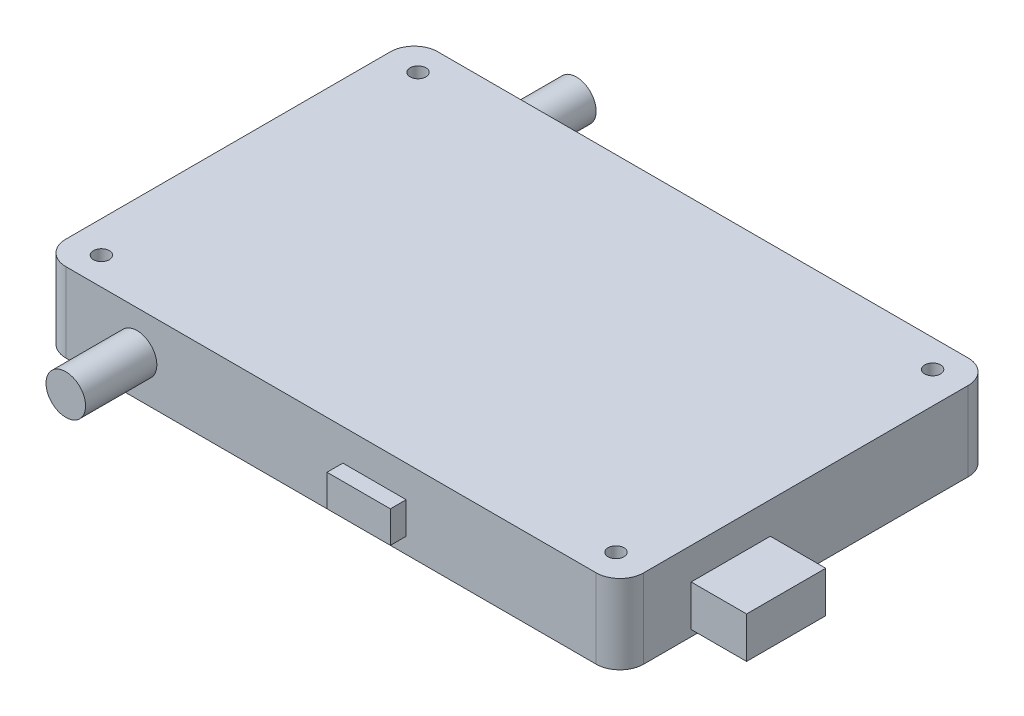
ISO-10303-21;
HEADER;
FILE_DESCRIPTION(('STEP AP214'),'2;1');
FILE_NAME('part.step','',(''),(''),'','','');
FILE_SCHEMA(('AUTOMOTIVE_DESIGN { 1 0 10303 214 1 1 1 1 }'));
ENDSEC;
DATA;
#1=APPLICATION_CONTEXT('core data for automotive mechanical design processes');
#2=APPLICATION_PROTOCOL_DEFINITION('international standard','automotive_design',2000,#1);
#3=PRODUCT_CONTEXT('',#1,'mechanical');
#4=PRODUCT('Part','Part','',(#3));
#5=PRODUCT_RELATED_PRODUCT_CATEGORY('part','',(#4));
#6=PRODUCT_DEFINITION_FORMATION('','',#4);
#7=PRODUCT_DEFINITION_CONTEXT('part definition',#1,'design');
#8=PRODUCT_DEFINITION('design','',#6,#7);
#9=PRODUCT_DEFINITION_SHAPE('','',#8);
#10=(LENGTH_UNIT() NAMED_UNIT(*) SI_UNIT(.MILLI.,.METRE.));
#11=(NAMED_UNIT(*) PLANE_ANGLE_UNIT() SI_UNIT($,.RADIAN.));
#12=(NAMED_UNIT(*) SI_UNIT($,.STERADIAN.) SOLID_ANGLE_UNIT());
#13=UNCERTAINTY_MEASURE_WITH_UNIT(LENGTH_MEASURE(1.E-05),#10,'distance_accuracy_value','');
#14=(GEOMETRIC_REPRESENTATION_CONTEXT(3) GLOBAL_UNCERTAINTY_ASSIGNED_CONTEXT((#13)) GLOBAL_UNIT_ASSIGNED_CONTEXT((#10,
#11,#12)) REPRESENTATION_CONTEXT('',''));
#15=CARTESIAN_POINT('',(0.,0.,0.));
#16=DIRECTION('',(0.,0.,1.));
#17=DIRECTION('',(1.,0.,0.));
#18=AXIS2_PLACEMENT_3D('',#15,#16,#17);
#19=CARTESIAN_POINT('',(73.,10.,0.));
#20=DIRECTION('',(-1.,0.,0.));
#21=DIRECTION('',(0.,0.,1.));
#22=AXIS2_PLACEMENT_3D('',#19,#20,#21);
#23=PLANE('',#22);
#24=DIRECTION('',(0.,0.,-1.));
#25=VECTOR('',#24,1.);
#26=CARTESIAN_POINT('',(73.,0.,0.));
#27=LINE('',#26,#25);
#28=CARTESIAN_POINT('',(73.,0.,-3.));
#29=VERTEX_POINT('',#28);
#30=CARTESIAN_POINT('',(73.,0.,-44.));
#31=VERTEX_POINT('',#30);
#32=EDGE_CURVE('E382',#29,#31,#27,.T.);
#33=ORIENTED_EDGE('',*,*,#32,.T.);
#34=DIRECTION('',(0.,-1.,0.));
#35=VECTOR('',#34,1.);
#36=CARTESIAN_POINT('',(73.,10.,-44.));
#37=LINE('',#36,#35);
#38=CARTESIAN_POINT('',(73.,10.,-44.));
#39=VERTEX_POINT('',#38);
#40=EDGE_CURVE('E411',#31,#39,#37,.F.);
#41=ORIENTED_EDGE('',*,*,#40,.T.);
#42=DIRECTION('',(0.,0.,-1.));
#43=VECTOR('',#42,1.);
#44=CARTESIAN_POINT('',(73.,10.,0.));
#45=LINE('',#44,#43);
#46=CARTESIAN_POINT('',(73.,10.,-3.));
#47=VERTEX_POINT('',#46);
#48=EDGE_CURVE('E366',#47,#39,#45,.T.);
#49=ORIENTED_EDGE('',*,*,#48,.F.);
#50=DIRECTION('',(0.,-1.,0.));
#51=VECTOR('',#50,1.);
#52=CARTESIAN_POINT('',(73.,10.,-3.));
#53=LINE('',#52,#51);
#54=EDGE_CURVE('E407',#47,#29,#53,.T.);
#55=ORIENTED_EDGE('',*,*,#54,.T.);
#56=EDGE_LOOP('',(#33,#41,#49,#55));
#57=FACE_BOUND('',#56,.T.);
#58=DIRECTION('',(0.,1.,0.));
#59=VECTOR('',#58,1.);
#60=CARTESIAN_POINT('',(73.,0.800000000000002,-19.));
#61=LINE('',#60,#59);
#62=CARTESIAN_POINT('',(73.,0.800000000000002,-19.));
#63=VERTEX_POINT('',#62);
#64=CARTESIAN_POINT('',(73.,6.,-19.));
#65=VERTEX_POINT('',#64);
#66=EDGE_CURVE('E200',#63,#65,#61,.T.);
#67=ORIENTED_EDGE('',*,*,#66,.F.);
#68=DIRECTION('',(0.,0.,-1.));
#69=VECTOR('',#68,1.);
#70=CARTESIAN_POINT('',(73.,0.800000000000002,-19.));
#71=LINE('',#70,#69);
#72=CARTESIAN_POINT('',(73.,0.800000000000002,-9.));
#73=VERTEX_POINT('',#72);
#74=EDGE_CURVE('E197',#73,#63,#71,.T.);
#75=ORIENTED_EDGE('',*,*,#74,.F.);
#76=DIRECTION('',(0.,-1.,0.));
#77=VECTOR('',#76,1.);
#78=CARTESIAN_POINT('',(73.,0.8,-9.));
#79=LINE('',#78,#77);
#80=CARTESIAN_POINT('',(73.,6.,-9.));
#81=VERTEX_POINT('',#80);
#82=EDGE_CURVE('E61',#81,#73,#79,.T.);
#83=ORIENTED_EDGE('',*,*,#82,.F.);
#84=DIRECTION('',(0.,0.,1.));
#85=VECTOR('',#84,1.);
#86=CARTESIAN_POINT('',(73.,6.,-19.));
#87=LINE('',#86,#85);
#88=EDGE_CURVE('E56',#65,#81,#87,.T.);
#89=ORIENTED_EDGE('',*,*,#88,.F.);
#90=EDGE_LOOP('',(#67,#75,#83,#89));
#91=FACE_BOUND('',#90,.T.);
#92=ADVANCED_FACE('F40',(#57,#91),#23,.F.);
#93=CARTESIAN_POINT('',(73.,10.,-47.));
#94=DIRECTION('',(0.,0.,1.));
#95=DIRECTION('',(1.,0.,0.));
#96=AXIS2_PLACEMENT_3D('',#93,#94,#95);
#97=PLANE('',#96);
#98=DIRECTION('',(-1.,0.,0.));
#99=VECTOR('',#98,1.);
#100=CARTESIAN_POINT('',(73.,10.,-47.));
#101=LINE('',#100,#99);
#102=CARTESIAN_POINT('',(70.,10.,-47.));
#103=VERTEX_POINT('',#102);
#104=CARTESIAN_POINT('',(3.,10.,-47.));
#105=VERTEX_POINT('',#104);
#106=EDGE_CURVE('E370',#103,#105,#101,.T.);
#107=ORIENTED_EDGE('',*,*,#106,.F.);
#108=DIRECTION('',(0.,-1.,0.));
#109=VECTOR('',#108,1.);
#110=CARTESIAN_POINT('',(70.,10.,-47.));
#111=LINE('',#110,#109);
#112=CARTESIAN_POINT('',(70.,0.,-47.));
#113=VERTEX_POINT('',#112);
#114=EDGE_CURVE('E391',#103,#113,#111,.T.);
#115=ORIENTED_EDGE('',*,*,#114,.T.);
#116=DIRECTION('',(-1.,0.,0.));
#117=VECTOR('',#116,1.);
#118=CARTESIAN_POINT('',(73.,0.,-47.));
#119=LINE('',#118,#117);
#120=CARTESIAN_POINT('',(3.,0.,-47.));
#121=VERTEX_POINT('',#120);
#122=EDGE_CURVE('E362',#113,#121,#119,.T.);
#123=ORIENTED_EDGE('',*,*,#122,.T.);
#124=DIRECTION('',(0.,-1.,0.));
#125=VECTOR('',#124,1.);
#126=CARTESIAN_POINT('',(3.,10.,-47.));
#127=LINE('',#126,#125);
#128=EDGE_CURVE('E374',#121,#105,#127,.F.);
#129=ORIENTED_EDGE('',*,*,#128,.T.);
#130=EDGE_LOOP('',(#107,#115,#123,#129));
#131=FACE_BOUND('',#130,.T.);
#132=CARTESIAN_POINT('',(12.,5.,-47.));
#133=DIRECTION('',(0.,0.,1.));
#134=DIRECTION('',(1.,0.,0.));
#135=AXIS2_PLACEMENT_3D('',#132,#133,#134);
#136=CIRCLE('',#135,2.5);
#137=CARTESIAN_POINT('',(14.5,5.,-47.));
#138=VERTEX_POINT('',#137);
#139=EDGE_CURVE('E49',#138,#138,#136,.F.);
#140=ORIENTED_EDGE('',*,*,#139,.F.);
#141=EDGE_LOOP('',(#140));
#142=FACE_BOUND('',#141,.T.);
#143=DIRECTION('',(1.,0.,0.));
#144=VECTOR('',#143,1.);
#145=CARTESIAN_POINT('',(59.,6.,-47.));
#146=LINE('',#145,#144);
#147=CARTESIAN_POINT('',(48.,6.,-47.));
#148=VERTEX_POINT('',#147);
#149=CARTESIAN_POINT('',(59.,6.,-47.));
#150=VERTEX_POINT('',#149);
#151=EDGE_CURVE('E202',#148,#150,#146,.T.);
#152=ORIENTED_EDGE('',*,*,#151,.F.);
#153=DIRECTION('',(0.,1.,0.));
#154=VECTOR('',#153,1.);
#155=CARTESIAN_POINT('',(48.,6.,-47.));
#156=LINE('',#155,#154);
#157=CARTESIAN_POINT('',(48.,2.,-47.));
#158=VERTEX_POINT('',#157);
#159=EDGE_CURVE('E218',#158,#148,#156,.T.);
#160=ORIENTED_EDGE('',*,*,#159,.F.);
#161=DIRECTION('',(-1.,0.,0.));
#162=VECTOR('',#161,1.);
#163=CARTESIAN_POINT('',(48.,2.,-47.));
#164=LINE('',#163,#162);
#165=CARTESIAN_POINT('',(59.,2.,-47.));
#166=VERTEX_POINT('',#165);
#167=EDGE_CURVE('E231',#166,#158,#164,.T.);
#168=ORIENTED_EDGE('',*,*,#167,.F.);
#169=DIRECTION('',(0.,-1.,0.));
#170=VECTOR('',#169,1.);
#171=CARTESIAN_POINT('',(59.,2.,-47.));
#172=LINE('',#171,#170);
#173=EDGE_CURVE('E207',#150,#166,#172,.T.);
#174=ORIENTED_EDGE('',*,*,#173,.F.);
#175=EDGE_LOOP('',(#152,#160,#168,#174));
#176=FACE_BOUND('',#175,.T.);
#177=ADVANCED_FACE('F459',(#131,#142,#176),#97,.F.);
#178=CARTESIAN_POINT('',(0.,10.,0.));
#179=DIRECTION('',(0.,0.,-1.));
#180=DIRECTION('',(-1.,0.,0.));
#181=AXIS2_PLACEMENT_3D('',#178,#179,#180);
#182=PLANE('',#181);
#183=DIRECTION('',(1.,0.,0.));
#184=VECTOR('',#183,1.);
#185=CARTESIAN_POINT('',(0.,0.,0.));
#186=LINE('',#185,#184);
#187=CARTESIAN_POINT('',(3.,0.,0.));
#188=VERTEX_POINT('',#187);
#189=CARTESIAN_POINT('',(70.,0.,0.));
#190=VERTEX_POINT('',#189);
#191=EDGE_CURVE('E378',#188,#190,#186,.T.);
#192=ORIENTED_EDGE('',*,*,#191,.T.);
#193=DIRECTION('',(0.,-1.,0.));
#194=VECTOR('',#193,1.);
#195=CARTESIAN_POINT('',(70.,10.,0.));
#196=LINE('',#195,#194);
#197=CARTESIAN_POINT('',(70.,10.,0.));
#198=VERTEX_POINT('',#197);
#199=EDGE_CURVE('E430',#190,#198,#196,.F.);
#200=ORIENTED_EDGE('',*,*,#199,.T.);
#201=DIRECTION('',(1.,0.,0.));
#202=VECTOR('',#201,1.);
#203=CARTESIAN_POINT('',(0.,10.,0.));
#204=LINE('',#203,#202);
#205=CARTESIAN_POINT('',(3.,10.,0.));
#206=VERTEX_POINT('',#205);
#207=EDGE_CURVE('E361',#206,#198,#204,.T.);
#208=ORIENTED_EDGE('',*,*,#207,.F.);
#209=DIRECTION('',(0.,-1.,0.));
#210=VECTOR('',#209,1.);
#211=CARTESIAN_POINT('',(3.,10.,0.));
#212=LINE('',#211,#210);
#213=EDGE_CURVE('E426',#206,#188,#212,.T.);
#214=ORIENTED_EDGE('',*,*,#213,.T.);
#215=EDGE_LOOP('',(#192,#200,#208,#214));
#216=FACE_BOUND('',#215,.T.);
#217=CARTESIAN_POINT('',(12.,5.,0.));
#218=DIRECTION('',(0.,0.,-1.));
#219=DIRECTION('',(-1.,0.,0.));
#220=AXIS2_PLACEMENT_3D('',#217,#218,#219);
#221=CIRCLE('',#220,2.5);
#222=CARTESIAN_POINT('',(9.5,5.,0.));
#223=VERTEX_POINT('',#222);
#224=EDGE_CURVE('E12',#223,#223,#221,.F.);
#225=ORIENTED_EDGE('',*,*,#224,.F.);
#226=EDGE_LOOP('',(#225));
#227=FACE_BOUND('',#226,.T.);
#228=DIRECTION('',(1.,0.,0.));
#229=VECTOR('',#228,1.);
#230=CARTESIAN_POINT('',(46.,2.,0.));
#231=LINE('',#230,#229);
#232=CARTESIAN_POINT('',(38.,2.,0.));
#233=VERTEX_POINT('',#232);
#234=CARTESIAN_POINT('',(46.,2.,0.));
#235=VERTEX_POINT('',#234);
#236=EDGE_CURVE('E253',#233,#235,#231,.T.);
#237=ORIENTED_EDGE('',*,*,#236,.F.);
#238=DIRECTION('',(0.,-1.,0.));
#239=VECTOR('',#238,1.);
#240=CARTESIAN_POINT('',(38.,2.,0.));
#241=LINE('',#240,#239);
#242=CARTESIAN_POINT('',(38.,6.,0.));
#243=VERTEX_POINT('',#242);
#244=EDGE_CURVE('E259',#243,#233,#241,.T.);
#245=ORIENTED_EDGE('',*,*,#244,.F.);
#246=DIRECTION('',(-1.,0.,0.));
#247=VECTOR('',#246,1.);
#248=CARTESIAN_POINT('',(38.,6.,0.));
#249=LINE('',#248,#247);
#250=CARTESIAN_POINT('',(46.,6.,0.));
#251=VERTEX_POINT('',#250);
#252=EDGE_CURVE('E276',#251,#243,#249,.T.);
#253=ORIENTED_EDGE('',*,*,#252,.F.);
#254=DIRECTION('',(0.,1.,0.));
#255=VECTOR('',#254,1.);
#256=CARTESIAN_POINT('',(46.,6.,0.));
#257=LINE('',#256,#255);
#258=EDGE_CURVE('E272',#235,#251,#257,.T.);
#259=ORIENTED_EDGE('',*,*,#258,.F.);
#260=EDGE_LOOP('',(#237,#245,#253,#259));
#261=FACE_BOUND('',#260,.T.);
#262=ADVANCED_FACE('F462',(#216,#227,#261),#182,.F.);
#263=CARTESIAN_POINT('',(4.,10.,-3.5));
#264=DIRECTION('',(0.,-1.,0.));
#265=DIRECTION('',(0.,0.,-1.));
#266=AXIS2_PLACEMENT_3D('',#263,#264,#265);
#267=CYLINDRICAL_SURFACE('',#266,1.);
#268=CARTESIAN_POINT('',(4.,10.,-3.5));
#269=DIRECTION('',(0.,1.,0.));
#270=DIRECTION('',(0.,0.,1.));
#271=AXIS2_PLACEMENT_3D('',#268,#269,#270);
#272=CIRCLE('',#271,1.);
#273=CARTESIAN_POINT('',(4.,10.,-2.5));
#274=VERTEX_POINT('',#273);
#275=EDGE_CURVE('E352',#274,#274,#272,.T.);
#276=ORIENTED_EDGE('',*,*,#275,.T.);
#277=EDGE_LOOP('',(#276));
#278=FACE_BOUND('',#277,.T.);
#279=CARTESIAN_POINT('',(4.,1.,-3.5));
#280=DIRECTION('',(0.,-1.,0.));
#281=DIRECTION('',(0.,0.,-1.));
#282=AXIS2_PLACEMENT_3D('',#279,#280,#281);
#283=CIRCLE('',#282,1.);
#284=CARTESIAN_POINT('',(4.,1.,-4.5));
#285=VERTEX_POINT('',#284);
#286=EDGE_CURVE('E344',#285,#285,#283,.T.);
#287=ORIENTED_EDGE('',*,*,#286,.T.);
#288=EDGE_LOOP('',(#287));
#289=FACE_BOUND('',#288,.T.);
#290=ADVANCED_FACE('F500',(#278,#289),#267,.F.);
#291=CARTESIAN_POINT('',(4.,10.,-43.5));
#292=DIRECTION('',(0.,-1.,0.));
#293=DIRECTION('',(0.,0.,-1.));
#294=AXIS2_PLACEMENT_3D('',#291,#292,#293);
#295=CYLINDRICAL_SURFACE('',#294,1.);
#296=CARTESIAN_POINT('',(4.,10.,-43.5));
#297=DIRECTION('',(0.,1.,0.));
#298=DIRECTION('',(0.,0.,-1.));
#299=AXIS2_PLACEMENT_3D('',#296,#297,#298);
#300=CIRCLE('',#299,1.);
#301=CARTESIAN_POINT('',(4.,10.,-44.5));
#302=VERTEX_POINT('',#301);
#303=EDGE_CURVE('E348',#302,#302,#300,.T.);
#304=ORIENTED_EDGE('',*,*,#303,.T.);
#305=EDGE_LOOP('',(#304));
#306=FACE_BOUND('',#305,.T.);
#307=CARTESIAN_POINT('',(4.,1.,-43.5));
#308=DIRECTION('',(0.,-1.,0.));
#309=DIRECTION('',(0.,0.,-1.));
#310=AXIS2_PLACEMENT_3D('',#307,#308,#309);
#311=CIRCLE('',#310,1.);
#312=CARTESIAN_POINT('',(4.,1.,-44.5));
#313=VERTEX_POINT('',#312);
#314=EDGE_CURVE('E447',#313,#313,#311,.T.);
#315=ORIENTED_EDGE('',*,*,#314,.T.);
#316=EDGE_LOOP('',(#315));
#317=FACE_BOUND('',#316,.T.);
#318=ADVANCED_FACE('F560',(#306,#317),#295,.F.);
#319=CARTESIAN_POINT('',(69.,10.,-3.5));
#320=DIRECTION('',(0.,-1.,0.));
#321=DIRECTION('',(0.,0.,-1.));
#322=AXIS2_PLACEMENT_3D('',#319,#320,#321);
#323=CYLINDRICAL_SURFACE('',#322,0.999999999999998);
#324=CARTESIAN_POINT('',(69.,10.,-3.5));
#325=DIRECTION('',(0.,1.,0.));
#326=DIRECTION('',(0.,0.,-1.));
#327=AXIS2_PLACEMENT_3D('',#324,#325,#326);
#328=CIRCLE('',#327,0.999999999999998);
#329=CARTESIAN_POINT('',(69.,10.,-4.5));
#330=VERTEX_POINT('',#329);
#331=EDGE_CURVE('E343',#330,#330,#328,.T.);
#332=ORIENTED_EDGE('',*,*,#331,.T.);
#333=EDGE_LOOP('',(#332));
#334=FACE_BOUND('',#333,.T.);
#335=CARTESIAN_POINT('',(69.,1.,-3.5));
#336=DIRECTION('',(0.,-1.,0.));
#337=DIRECTION('',(0.,0.,-1.));
#338=AXIS2_PLACEMENT_3D('',#335,#336,#337);
#339=CIRCLE('',#338,0.999999999999998);
#340=CARTESIAN_POINT('',(69.,1.,-4.5));
#341=VERTEX_POINT('',#340);
#342=EDGE_CURVE('E443',#341,#341,#339,.T.);
#343=ORIENTED_EDGE('',*,*,#342,.T.);
#344=EDGE_LOOP('',(#343));
#345=FACE_BOUND('',#344,.T.);
#346=ADVANCED_FACE('F564',(#334,#345),#323,.F.);
#347=CARTESIAN_POINT('',(69.,10.,-43.5));
#348=DIRECTION('',(0.,-1.,0.));
#349=DIRECTION('',(0.,0.,-1.));
#350=AXIS2_PLACEMENT_3D('',#347,#348,#349);
#351=CYLINDRICAL_SURFACE('',#350,0.999999999999998);
#352=CARTESIAN_POINT('',(69.,10.,-43.5));
#353=DIRECTION('',(0.,1.,0.));
#354=DIRECTION('',(0.,0.,1.));
#355=AXIS2_PLACEMENT_3D('',#352,#353,#354);
#356=CIRCLE('',#355,0.999999999999998);
#357=CARTESIAN_POINT('',(69.,10.,-42.5));
#358=VERTEX_POINT('',#357);
#359=EDGE_CURVE('E339',#358,#358,#356,.T.);
#360=ORIENTED_EDGE('',*,*,#359,.T.);
#361=EDGE_LOOP('',(#360));
#362=FACE_BOUND('',#361,.T.);
#363=CARTESIAN_POINT('',(69.,1.,-43.5));
#364=DIRECTION('',(0.,-1.,0.));
#365=DIRECTION('',(0.,0.,-1.));
#366=AXIS2_PLACEMENT_3D('',#363,#364,#365);
#367=CIRCLE('',#366,0.999999999999998);
#368=CARTESIAN_POINT('',(69.,1.,-44.5));
#369=VERTEX_POINT('',#368);
#370=EDGE_CURVE('E335',#369,#369,#367,.T.);
#371=ORIENTED_EDGE('',*,*,#370,.T.);
#372=EDGE_LOOP('',(#371));
#373=FACE_BOUND('',#372,.T.);
#374=ADVANCED_FACE('F552',(#362,#373),#351,.F.);
#375=CARTESIAN_POINT('',(0.,10.,0.));
#376=DIRECTION('',(0.,1.,0.));
#377=DIRECTION('',(0.,0.,1.));
#378=AXIS2_PLACEMENT_3D('',#375,#376,#377);
#379=PLANE('',#378);
#380=ORIENTED_EDGE('',*,*,#331,.F.);
#381=EDGE_LOOP('',(#380));
#382=FACE_BOUND('',#381,.T.);
#383=ORIENTED_EDGE('',*,*,#275,.F.);
#384=EDGE_LOOP('',(#383));
#385=FACE_BOUND('',#384,.T.);
#386=ORIENTED_EDGE('',*,*,#48,.T.);
#387=CARTESIAN_POINT('',(70.,10.,-44.));
#388=DIRECTION('',(0.,1.,0.));
#389=DIRECTION('',(0.,0.,1.));
#390=AXIS2_PLACEMENT_3D('',#387,#388,#389);
#391=CIRCLE('',#390,3.);
#392=EDGE_CURVE('E423',#39,#103,#391,.T.);
#393=ORIENTED_EDGE('',*,*,#392,.T.);
#394=ORIENTED_EDGE('',*,*,#106,.T.);
#395=CARTESIAN_POINT('',(3.,10.,-44.));
#396=DIRECTION('',(0.,1.,0.));
#397=DIRECTION('',(0.,0.,1.));
#398=AXIS2_PLACEMENT_3D('',#395,#396,#397);
#399=CIRCLE('',#398,3.);
#400=CARTESIAN_POINT('',(0.,10.,-44.));
#401=VERTEX_POINT('',#400);
#402=EDGE_CURVE('E417',#105,#401,#399,.T.);
#403=ORIENTED_EDGE('',*,*,#402,.T.);
#404=DIRECTION('',(0.,0.,1.));
#405=VECTOR('',#404,1.);
#406=CARTESIAN_POINT('',(0.,10.,-47.));
#407=LINE('',#406,#405);
#408=CARTESIAN_POINT('',(0.,10.,-3.));
#409=VERTEX_POINT('',#408);
#410=EDGE_CURVE('E357',#401,#409,#407,.T.);
#411=ORIENTED_EDGE('',*,*,#410,.T.);
#412=CARTESIAN_POINT('',(3.,10.,-3.));
#413=DIRECTION('',(0.,1.,0.));
#414=DIRECTION('',(0.,0.,1.));
#415=AXIS2_PLACEMENT_3D('',#412,#413,#414);
#416=CIRCLE('',#415,3.);
#417=EDGE_CURVE('E414',#409,#206,#416,.T.);
#418=ORIENTED_EDGE('',*,*,#417,.T.);
#419=ORIENTED_EDGE('',*,*,#207,.T.);
#420=CARTESIAN_POINT('',(70.,10.,-3.));
#421=DIRECTION('',(0.,1.,0.));
#422=DIRECTION('',(0.,0.,1.));
#423=AXIS2_PLACEMENT_3D('',#420,#421,#422);
#424=CIRCLE('',#423,3.);
#425=EDGE_CURVE('E420',#198,#47,#424,.T.);
#426=ORIENTED_EDGE('',*,*,#425,.T.);
#427=EDGE_LOOP('',(#386,#393,#394,#403,#411,#418,#419,#426));
#428=FACE_BOUND('',#427,.T.);
#429=ORIENTED_EDGE('',*,*,#303,.F.);
#430=EDGE_LOOP('',(#429));
#431=FACE_BOUND('',#430,.T.);
#432=ORIENTED_EDGE('',*,*,#359,.F.);
#433=EDGE_LOOP('',(#432));
#434=FACE_BOUND('',#433,.T.);
#435=ADVANCED_FACE('F527',(#382,#385,#428,#431,#434),#379,.T.);
#436=CARTESIAN_POINT('',(0.,0.,0.));
#437=DIRECTION('',(0.,1.,0.));
#438=DIRECTION('',(0.,0.,1.));
#439=AXIS2_PLACEMENT_3D('',#436,#437,#438);
#440=PLANE('',#439);
#441=CARTESIAN_POINT('',(69.,0.,-43.5));
#442=DIRECTION('',(0.,-1.,0.));
#443=DIRECTION('',(0.,0.,-1.));
#444=AXIS2_PLACEMENT_3D('',#441,#442,#443);
#445=CIRCLE('',#444,2.);
#446=CARTESIAN_POINT('',(69.,0.,-45.5));
#447=VERTEX_POINT('',#446);
#448=EDGE_CURVE('E306',#447,#447,#445,.T.);
#449=ORIENTED_EDGE('',*,*,#448,.F.);
#450=EDGE_LOOP('',(#449));
#451=FACE_BOUND('',#450,.T.);
#452=CARTESIAN_POINT('',(69.,0.,-3.5));
#453=DIRECTION('',(0.,-1.,0.));
#454=DIRECTION('',(0.,0.,-1.));
#455=AXIS2_PLACEMENT_3D('',#452,#453,#454);
#456=CIRCLE('',#455,2.);
#457=CARTESIAN_POINT('',(69.,0.,-5.5));
#458=VERTEX_POINT('',#457);
#459=EDGE_CURVE('E320',#458,#458,#456,.T.);
#460=ORIENTED_EDGE('',*,*,#459,.F.);
#461=EDGE_LOOP('',(#460));
#462=FACE_BOUND('',#461,.T.);
#463=CARTESIAN_POINT('',(4.,0.,-3.5));
#464=DIRECTION('',(0.,-1.,0.));
#465=DIRECTION('',(0.,0.,-1.));
#466=AXIS2_PLACEMENT_3D('',#463,#464,#465);
#467=CIRCLE('',#466,2.);
#468=CARTESIAN_POINT('',(4.,0.,-5.5));
#469=VERTEX_POINT('',#468);
#470=EDGE_CURVE('E312',#469,#469,#467,.T.);
#471=ORIENTED_EDGE('',*,*,#470,.F.);
#472=EDGE_LOOP('',(#471));
#473=FACE_BOUND('',#472,.T.);
#474=CARTESIAN_POINT('',(4.,0.,-43.5));
#475=DIRECTION('',(0.,-1.,0.));
#476=DIRECTION('',(0.,0.,-1.));
#477=AXIS2_PLACEMENT_3D('',#474,#475,#476);
#478=CIRCLE('',#477,2.);
#479=CARTESIAN_POINT('',(4.,0.,-45.5));
#480=VERTEX_POINT('',#479);
#481=EDGE_CURVE('E311',#480,#480,#478,.T.);
#482=ORIENTED_EDGE('',*,*,#481,.F.);
#483=EDGE_LOOP('',(#482));
#484=FACE_BOUND('',#483,.T.);
#485=ORIENTED_EDGE('',*,*,#122,.F.);
#486=CARTESIAN_POINT('',(70.,0.,-44.));
#487=DIRECTION('',(0.,1.,0.));
#488=DIRECTION('',(0.,0.,1.));
#489=AXIS2_PLACEMENT_3D('',#486,#487,#488);
#490=CIRCLE('',#489,3.);
#491=EDGE_CURVE('E404',#113,#31,#490,.F.);
#492=ORIENTED_EDGE('',*,*,#491,.T.);
#493=ORIENTED_EDGE('',*,*,#32,.F.);
#494=CARTESIAN_POINT('',(70.,0.,-3.));
#495=DIRECTION('',(0.,1.,0.));
#496=DIRECTION('',(0.,0.,1.));
#497=AXIS2_PLACEMENT_3D('',#494,#495,#496);
#498=CIRCLE('',#497,3.);
#499=EDGE_CURVE('E401',#29,#190,#498,.F.);
#500=ORIENTED_EDGE('',*,*,#499,.T.);
#501=ORIENTED_EDGE('',*,*,#191,.F.);
#502=CARTESIAN_POINT('',(3.,0.,-3.));
#503=DIRECTION('',(0.,1.,0.));
#504=DIRECTION('',(0.,0.,1.));
#505=AXIS2_PLACEMENT_3D('',#502,#503,#504);
#506=CIRCLE('',#505,3.);
#507=CARTESIAN_POINT('',(0.,0.,-3.));
#508=VERTEX_POINT('',#507);
#509=EDGE_CURVE('E395',#188,#508,#506,.F.);
#510=ORIENTED_EDGE('',*,*,#509,.T.);
#511=DIRECTION('',(0.,0.,1.));
#512=VECTOR('',#511,1.);
#513=CARTESIAN_POINT('',(0.,0.,-47.));
#514=LINE('',#513,#512);
#515=CARTESIAN_POINT('',(0.,0.,-44.));
#516=VERTEX_POINT('',#515);
#517=EDGE_CURVE('E356',#516,#508,#514,.T.);
#518=ORIENTED_EDGE('',*,*,#517,.F.);
#519=CARTESIAN_POINT('',(3.,0.,-44.));
#520=DIRECTION('',(0.,1.,0.));
#521=DIRECTION('',(0.,0.,1.));
#522=AXIS2_PLACEMENT_3D('',#519,#520,#521);
#523=CIRCLE('',#522,3.);
#524=EDGE_CURVE('E398',#516,#121,#523,.F.);
#525=ORIENTED_EDGE('',*,*,#524,.T.);
#526=EDGE_LOOP('',(#485,#492,#493,#500,#501,#510,#518,#525));
#527=FACE_BOUND('',#526,.T.);
#528=ADVANCED_FACE('F506',(#451,#462,#473,#484,#527),#440,.F.);
#529=CARTESIAN_POINT('',(0.,10.,-47.));
#530=DIRECTION('',(1.,0.,0.));
#531=DIRECTION('',(0.,0.,-1.));
#532=AXIS2_PLACEMENT_3D('',#529,#530,#531);
#533=PLANE('',#532);
#534=ORIENTED_EDGE('',*,*,#410,.F.);
#535=DIRECTION('',(0.,-1.,0.));
#536=VECTOR('',#535,1.);
#537=CARTESIAN_POINT('',(0.,10.,-44.));
#538=LINE('',#537,#536);
#539=EDGE_CURVE('E436',#401,#516,#538,.T.);
#540=ORIENTED_EDGE('',*,*,#539,.T.);
#541=ORIENTED_EDGE('',*,*,#517,.T.);
#542=DIRECTION('',(0.,-1.,0.));
#543=VECTOR('',#542,1.);
#544=CARTESIAN_POINT('',(0.,10.,-3.));
#545=LINE('',#544,#543);
#546=EDGE_CURVE('E433',#508,#409,#545,.F.);
#547=ORIENTED_EDGE('',*,*,#546,.T.);
#548=EDGE_LOOP('',(#534,#540,#541,#547));
#549=FACE_BOUND('',#548,.T.);
#550=ADVANCED_FACE('F502',(#549),#533,.F.);
#551=CARTESIAN_POINT('',(70.,10.,-44.));
#552=DIRECTION('',(0.,-1.,0.));
#553=DIRECTION('',(0.,0.,-1.));
#554=AXIS2_PLACEMENT_3D('',#551,#552,#553);
#555=CYLINDRICAL_SURFACE('',#554,3.);
#556=ORIENTED_EDGE('',*,*,#392,.F.);
#557=ORIENTED_EDGE('',*,*,#40,.F.);
#558=ORIENTED_EDGE('',*,*,#491,.F.);
#559=ORIENTED_EDGE('',*,*,#114,.F.);
#560=EDGE_LOOP('',(#556,#557,#558,#559));
#561=FACE_BOUND('',#560,.T.);
#562=ADVANCED_FACE('F505',(#561),#555,.T.);
#563=CARTESIAN_POINT('',(70.,10.,-3.));
#564=DIRECTION('',(0.,-1.,0.));
#565=DIRECTION('',(0.,0.,-1.));
#566=AXIS2_PLACEMENT_3D('',#563,#564,#565);
#567=CYLINDRICAL_SURFACE('',#566,3.);
#568=ORIENTED_EDGE('',*,*,#425,.F.);
#569=ORIENTED_EDGE('',*,*,#199,.F.);
#570=ORIENTED_EDGE('',*,*,#499,.F.);
#571=ORIENTED_EDGE('',*,*,#54,.F.);
#572=EDGE_LOOP('',(#568,#569,#570,#571));
#573=FACE_BOUND('',#572,.T.);
#574=ADVANCED_FACE('F510',(#573),#567,.T.);
#575=CARTESIAN_POINT('',(3.,10.,-44.));
#576=DIRECTION('',(0.,-1.,0.));
#577=DIRECTION('',(0.,0.,-1.));
#578=AXIS2_PLACEMENT_3D('',#575,#576,#577);
#579=CYLINDRICAL_SURFACE('',#578,3.);
#580=ORIENTED_EDGE('',*,*,#402,.F.);
#581=ORIENTED_EDGE('',*,*,#128,.F.);
#582=ORIENTED_EDGE('',*,*,#524,.F.);
#583=ORIENTED_EDGE('',*,*,#539,.F.);
#584=EDGE_LOOP('',(#580,#581,#582,#583));
#585=FACE_BOUND('',#584,.T.);
#586=ADVANCED_FACE('F513',(#585),#579,.T.);
#587=CARTESIAN_POINT('',(3.,10.,-3.));
#588=DIRECTION('',(0.,-1.,0.));
#589=DIRECTION('',(0.,0.,-1.));
#590=AXIS2_PLACEMENT_3D('',#587,#588,#589);
#591=CYLINDRICAL_SURFACE('',#590,3.);
#592=ORIENTED_EDGE('',*,*,#417,.F.);
#593=ORIENTED_EDGE('',*,*,#546,.F.);
#594=ORIENTED_EDGE('',*,*,#509,.F.);
#595=ORIENTED_EDGE('',*,*,#213,.F.);
#596=EDGE_LOOP('',(#592,#593,#594,#595));
#597=FACE_BOUND('',#596,.T.);
#598=ADVANCED_FACE('F42',(#597),#591,.T.);
#599=CARTESIAN_POINT('',(69.,1.,-43.5));
#600=DIRECTION('',(0.,-1.,0.));
#601=DIRECTION('',(0.,0.,-1.));
#602=AXIS2_PLACEMENT_3D('',#599,#600,#601);
#603=CYLINDRICAL_SURFACE('',#602,2.);
#604=CARTESIAN_POINT('',(69.,1.,-43.5));
#605=DIRECTION('',(0.,-1.,0.));
#606=DIRECTION('',(0.,0.,-1.));
#607=AXIS2_PLACEMENT_3D('',#604,#605,#606);
#608=CIRCLE('',#607,2.);
#609=CARTESIAN_POINT('',(69.,1.,-45.5));
#610=VERTEX_POINT('',#609);
#611=EDGE_CURVE('E324',#610,#610,#608,.T.);
#612=ORIENTED_EDGE('',*,*,#611,.F.);
#613=EDGE_LOOP('',(#612));
#614=FACE_BOUND('',#613,.T.);
#615=ORIENTED_EDGE('',*,*,#448,.T.);
#616=EDGE_LOOP('',(#615));
#617=FACE_BOUND('',#616,.T.);
#618=ADVANCED_FACE('F520',(#614,#617),#603,.F.);
#619=CARTESIAN_POINT('',(69.,1.,-43.5));
#620=DIRECTION('',(0.,-1.,0.));
#621=DIRECTION('',(0.,0.,-1.));
#622=AXIS2_PLACEMENT_3D('',#619,#620,#621);
#623=PLANE('',#622);
#624=ORIENTED_EDGE('',*,*,#370,.F.);
#625=EDGE_LOOP('',(#624));
#626=FACE_BOUND('',#625,.T.);
#627=ORIENTED_EDGE('',*,*,#611,.T.);
#628=EDGE_LOOP('',(#627));
#629=FACE_BOUND('',#628,.T.);
#630=ADVANCED_FACE('F584',(#626,#629),#623,.T.);
#631=CARTESIAN_POINT('',(69.,1.,-3.5));
#632=DIRECTION('',(0.,-1.,0.));
#633=DIRECTION('',(0.,0.,-1.));
#634=AXIS2_PLACEMENT_3D('',#631,#632,#633);
#635=CYLINDRICAL_SURFACE('',#634,2.);
#636=CARTESIAN_POINT('',(69.,1.,-3.5));
#637=DIRECTION('',(0.,-1.,0.));
#638=DIRECTION('',(0.,0.,-1.));
#639=AXIS2_PLACEMENT_3D('',#636,#637,#638);
#640=CIRCLE('',#639,2.);
#641=CARTESIAN_POINT('',(69.,1.,-5.5));
#642=VERTEX_POINT('',#641);
#643=EDGE_CURVE('E316',#642,#642,#640,.T.);
#644=ORIENTED_EDGE('',*,*,#643,.F.);
#645=EDGE_LOOP('',(#644));
#646=FACE_BOUND('',#645,.T.);
#647=ORIENTED_EDGE('',*,*,#459,.T.);
#648=EDGE_LOOP('',(#647));
#649=FACE_BOUND('',#648,.T.);
#650=ADVANCED_FACE('F588',(#646,#649),#635,.F.);
#651=CARTESIAN_POINT('',(69.,1.,-3.5));
#652=DIRECTION('',(0.,-1.,0.));
#653=DIRECTION('',(0.,0.,-1.));
#654=AXIS2_PLACEMENT_3D('',#651,#652,#653);
#655=PLANE('',#654);
#656=ORIENTED_EDGE('',*,*,#342,.F.);
#657=EDGE_LOOP('',(#656));
#658=FACE_BOUND('',#657,.T.);
#659=ORIENTED_EDGE('',*,*,#643,.T.);
#660=EDGE_LOOP('',(#659));
#661=FACE_BOUND('',#660,.T.);
#662=ADVANCED_FACE('F576',(#658,#661),#655,.T.);
#663=CARTESIAN_POINT('',(4.,1.,-43.5));
#664=DIRECTION('',(0.,-1.,0.));
#665=DIRECTION('',(0.,0.,-1.));
#666=AXIS2_PLACEMENT_3D('',#663,#664,#665);
#667=CYLINDRICAL_SURFACE('',#666,2.);
#668=CARTESIAN_POINT('',(4.,1.,-43.5));
#669=DIRECTION('',(0.,-1.,0.));
#670=DIRECTION('',(0.,0.,-1.));
#671=AXIS2_PLACEMENT_3D('',#668,#669,#670);
#672=CIRCLE('',#671,2.);
#673=CARTESIAN_POINT('',(4.,1.,-45.5));
#674=VERTEX_POINT('',#673);
#675=EDGE_CURVE('E331',#674,#674,#672,.T.);
#676=ORIENTED_EDGE('',*,*,#675,.F.);
#677=EDGE_LOOP('',(#676));
#678=FACE_BOUND('',#677,.T.);
#679=ORIENTED_EDGE('',*,*,#481,.T.);
#680=EDGE_LOOP('',(#679));
#681=FACE_BOUND('',#680,.T.);
#682=ADVANCED_FACE('F572',(#678,#681),#667,.F.);
#683=CARTESIAN_POINT('',(4.,1.,-43.5));
#684=DIRECTION('',(0.,-1.,0.));
#685=DIRECTION('',(0.,0.,-1.));
#686=AXIS2_PLACEMENT_3D('',#683,#684,#685);
#687=PLANE('',#686);
#688=ORIENTED_EDGE('',*,*,#314,.F.);
#689=EDGE_LOOP('',(#688));
#690=FACE_BOUND('',#689,.T.);
#691=ORIENTED_EDGE('',*,*,#675,.T.);
#692=EDGE_LOOP('',(#691));
#693=FACE_BOUND('',#692,.T.);
#694=ADVANCED_FACE('F575',(#690,#693),#687,.T.);
#695=CARTESIAN_POINT('',(4.,1.,-3.5));
#696=DIRECTION('',(0.,-1.,0.));
#697=DIRECTION('',(0.,0.,-1.));
#698=AXIS2_PLACEMENT_3D('',#695,#696,#697);
#699=CYLINDRICAL_SURFACE('',#698,2.);
#700=CARTESIAN_POINT('',(4.,1.,-3.5));
#701=DIRECTION('',(0.,-1.,0.));
#702=DIRECTION('',(0.,0.,-1.));
#703=AXIS2_PLACEMENT_3D('',#700,#701,#702);
#704=CIRCLE('',#703,2.);
#705=CARTESIAN_POINT('',(4.,1.,-5.5));
#706=VERTEX_POINT('',#705);
#707=EDGE_CURVE('E307',#706,#706,#704,.T.);
#708=ORIENTED_EDGE('',*,*,#707,.F.);
#709=EDGE_LOOP('',(#708));
#710=FACE_BOUND('',#709,.T.);
#711=ORIENTED_EDGE('',*,*,#470,.T.);
#712=EDGE_LOOP('',(#711));
#713=FACE_BOUND('',#712,.T.);
#714=ADVANCED_FACE('F580',(#710,#713),#699,.F.);
#715=CARTESIAN_POINT('',(4.,1.,-3.5));
#716=DIRECTION('',(0.,-1.,0.));
#717=DIRECTION('',(0.,0.,-1.));
#718=AXIS2_PLACEMENT_3D('',#715,#716,#717);
#719=PLANE('',#718);
#720=ORIENTED_EDGE('',*,*,#286,.F.);
#721=EDGE_LOOP('',(#720));
#722=FACE_BOUND('',#721,.T.);
#723=ORIENTED_EDGE('',*,*,#707,.T.);
#724=EDGE_LOOP('',(#723));
#725=FACE_BOUND('',#724,.T.);
#726=ADVANCED_FACE('F598',(#722,#725),#719,.T.);
#727=CARTESIAN_POINT('',(12.,5.,-55.5));
#728=DIRECTION('',(0.,0.,1.));
#729=DIRECTION('',(1.,0.,0.));
#730=AXIS2_PLACEMENT_3D('',#727,#728,#729);
#731=CYLINDRICAL_SURFACE('',#730,2.5);
#732=CARTESIAN_POINT('',(12.,5.,-55.5));
#733=DIRECTION('',(0.,0.,-1.));
#734=DIRECTION('',(-1.,0.,0.));
#735=AXIS2_PLACEMENT_3D('',#732,#733,#734);
#736=CIRCLE('',#735,2.5);
#737=CARTESIAN_POINT('',(9.5,5.,-55.5));
#738=VERTEX_POINT('',#737);
#739=EDGE_CURVE('E302',#738,#738,#736,.T.);
#740=ORIENTED_EDGE('',*,*,#739,.F.);
#741=EDGE_LOOP('',(#740));
#742=FACE_BOUND('',#741,.T.);
#743=ORIENTED_EDGE('',*,*,#139,.T.);
#744=EDGE_LOOP('',(#743));
#745=FACE_BOUND('',#744,.T.);
#746=ADVANCED_FACE('F457',(#742,#745),#731,.T.);
#747=CARTESIAN_POINT('',(12.,5.,-55.5));
#748=DIRECTION('',(0.,0.,-1.));
#749=DIRECTION('',(-1.,0.,0.));
#750=AXIS2_PLACEMENT_3D('',#747,#748,#749);
#751=PLANE('',#750);
#752=ORIENTED_EDGE('',*,*,#739,.T.);
#753=EDGE_LOOP('',(#752));
#754=FACE_BOUND('',#753,.T.);
#755=ADVANCED_FACE('F605',(#754),#751,.T.);
#756=CARTESIAN_POINT('',(12.,5.,9.));
#757=DIRECTION('',(0.,0.,-1.));
#758=DIRECTION('',(-1.,0.,0.));
#759=AXIS2_PLACEMENT_3D('',#756,#757,#758);
#760=CYLINDRICAL_SURFACE('',#759,2.5);
#761=CARTESIAN_POINT('',(12.,5.,9.));
#762=DIRECTION('',(0.,0.,1.));
#763=DIRECTION('',(1.,0.,0.));
#764=AXIS2_PLACEMENT_3D('',#761,#762,#763);
#765=CIRCLE('',#764,2.5);
#766=CARTESIAN_POINT('',(14.5,5.,9.));
#767=VERTEX_POINT('',#766);
#768=EDGE_CURVE('E298',#767,#767,#765,.T.);
#769=ORIENTED_EDGE('',*,*,#768,.F.);
#770=EDGE_LOOP('',(#769));
#771=FACE_BOUND('',#770,.T.);
#772=ORIENTED_EDGE('',*,*,#224,.T.);
#773=EDGE_LOOP('',(#772));
#774=FACE_BOUND('',#773,.T.);
#775=ADVANCED_FACE('F609',(#771,#774),#760,.T.);
#776=CARTESIAN_POINT('',(12.,5.,9.));
#777=DIRECTION('',(0.,0.,1.));
#778=DIRECTION('',(1.,0.,0.));
#779=AXIS2_PLACEMENT_3D('',#776,#777,#778);
#780=PLANE('',#779);
#781=ORIENTED_EDGE('',*,*,#768,.T.);
#782=EDGE_LOOP('',(#781));
#783=FACE_BOUND('',#782,.T.);
#784=ADVANCED_FACE('F613',(#783),#780,.T.);
#785=CARTESIAN_POINT('',(46.,2.,2.));
#786=DIRECTION('',(0.,1.,0.));
#787=DIRECTION('',(-1.,0.,0.));
#788=AXIS2_PLACEMENT_3D('',#785,#786,#787);
#789=PLANE('',#788);
#790=ORIENTED_EDGE('',*,*,#236,.T.);
#791=DIRECTION('',(0.,0.,-1.));
#792=VECTOR('',#791,1.);
#793=CARTESIAN_POINT('',(46.,2.,2.));
#794=LINE('',#793,#792);
#795=CARTESIAN_POINT('',(46.,2.,2.));
#796=VERTEX_POINT('',#795);
#797=EDGE_CURVE('E294',#796,#235,#794,.T.);
#798=ORIENTED_EDGE('',*,*,#797,.F.);
#799=DIRECTION('',(1.,0.,0.));
#800=VECTOR('',#799,1.);
#801=CARTESIAN_POINT('',(46.,2.,2.));
#802=LINE('',#801,#800);
#803=CARTESIAN_POINT('',(38.,2.,2.));
#804=VERTEX_POINT('',#803);
#805=EDGE_CURVE('E254',#804,#796,#802,.T.);
#806=ORIENTED_EDGE('',*,*,#805,.F.);
#807=DIRECTION('',(0.,0.,-1.));
#808=VECTOR('',#807,1.);
#809=CARTESIAN_POINT('',(38.,2.,2.));
#810=LINE('',#809,#808);
#811=EDGE_CURVE('E268',#804,#233,#810,.T.);
#812=ORIENTED_EDGE('',*,*,#811,.T.);
#813=EDGE_LOOP('',(#790,#798,#806,#812));
#814=FACE_BOUND('',#813,.T.);
#815=ADVANCED_FACE('F617',(#814),#789,.F.);
#816=CARTESIAN_POINT('',(46.,6.,2.));
#817=DIRECTION('',(-1.,0.,0.));
#818=DIRECTION('',(0.,0.,1.));
#819=AXIS2_PLACEMENT_3D('',#816,#817,#818);
#820=PLANE('',#819);
#821=ORIENTED_EDGE('',*,*,#258,.T.);
#822=DIRECTION('',(0.,0.,-1.));
#823=VECTOR('',#822,1.);
#824=CARTESIAN_POINT('',(46.,6.,2.));
#825=LINE('',#824,#823);
#826=CARTESIAN_POINT('',(46.,6.,2.));
#827=VERTEX_POINT('',#826);
#828=EDGE_CURVE('E290',#827,#251,#825,.T.);
#829=ORIENTED_EDGE('',*,*,#828,.F.);
#830=DIRECTION('',(0.,1.,0.));
#831=VECTOR('',#830,1.);
#832=CARTESIAN_POINT('',(46.,6.,2.));
#833=LINE('',#832,#831);
#834=EDGE_CURVE('E258',#796,#827,#833,.T.);
#835=ORIENTED_EDGE('',*,*,#834,.F.);
#836=ORIENTED_EDGE('',*,*,#797,.T.);
#837=EDGE_LOOP('',(#821,#829,#835,#836));
#838=FACE_BOUND('',#837,.T.);
#839=ADVANCED_FACE('F621',(#838),#820,.F.);
#840=CARTESIAN_POINT('',(38.,6.,2.));
#841=DIRECTION('',(0.,-1.,0.));
#842=DIRECTION('',(1.,0.,0.));
#843=AXIS2_PLACEMENT_3D('',#840,#841,#842);
#844=PLANE('',#843);
#845=ORIENTED_EDGE('',*,*,#252,.T.);
#846=DIRECTION('',(0.,0.,-1.));
#847=VECTOR('',#846,1.);
#848=CARTESIAN_POINT('',(38.,6.,2.));
#849=LINE('',#848,#847);
#850=CARTESIAN_POINT('',(38.,6.,2.));
#851=VERTEX_POINT('',#850);
#852=EDGE_CURVE('E286',#851,#243,#849,.T.);
#853=ORIENTED_EDGE('',*,*,#852,.F.);
#854=DIRECTION('',(-1.,0.,0.));
#855=VECTOR('',#854,1.);
#856=CARTESIAN_POINT('',(38.,6.,2.));
#857=LINE('',#856,#855);
#858=EDGE_CURVE('E262',#827,#851,#857,.T.);
#859=ORIENTED_EDGE('',*,*,#858,.F.);
#860=ORIENTED_EDGE('',*,*,#828,.T.);
#861=EDGE_LOOP('',(#845,#853,#859,#860));
#862=FACE_BOUND('',#861,.T.);
#863=ADVANCED_FACE('F625',(#862),#844,.F.);
#864=CARTESIAN_POINT('',(38.,2.,2.));
#865=DIRECTION('',(1.,0.,0.));
#866=DIRECTION('',(0.,0.,-1.));
#867=AXIS2_PLACEMENT_3D('',#864,#865,#866);
#868=PLANE('',#867);
#869=ORIENTED_EDGE('',*,*,#244,.T.);
#870=ORIENTED_EDGE('',*,*,#811,.F.);
#871=DIRECTION('',(0.,-1.,0.));
#872=VECTOR('',#871,1.);
#873=CARTESIAN_POINT('',(38.,2.,2.));
#874=LINE('',#873,#872);
#875=EDGE_CURVE('E265',#851,#804,#874,.T.);
#876=ORIENTED_EDGE('',*,*,#875,.F.);
#877=ORIENTED_EDGE('',*,*,#852,.T.);
#878=EDGE_LOOP('',(#869,#870,#876,#877));
#879=FACE_BOUND('',#878,.T.);
#880=ADVANCED_FACE('F629',(#879),#868,.F.);
#881=CARTESIAN_POINT('',(0.,0.,2.));
#882=DIRECTION('',(0.,0.,-1.));
#883=DIRECTION('',(-1.,0.,0.));
#884=AXIS2_PLACEMENT_3D('',#881,#882,#883);
#885=PLANE('',#884);
#886=ORIENTED_EDGE('',*,*,#805,.T.);
#887=ORIENTED_EDGE('',*,*,#834,.T.);
#888=ORIENTED_EDGE('',*,*,#858,.T.);
#889=ORIENTED_EDGE('',*,*,#875,.T.);
#890=EDGE_LOOP('',(#886,#887,#888,#889));
#891=FACE_BOUND('',#890,.T.);
#892=ADVANCED_FACE('F489',(#891),#885,.F.);
#893=CARTESIAN_POINT('',(59.,6.,-49.));
#894=DIRECTION('',(0.,-1.,0.));
#895=DIRECTION('',(0.,0.,-1.));
#896=AXIS2_PLACEMENT_3D('',#893,#894,#895);
#897=PLANE('',#896);
#898=ORIENTED_EDGE('',*,*,#151,.T.);
#899=DIRECTION('',(0.,0.,1.));
#900=VECTOR('',#899,1.);
#901=CARTESIAN_POINT('',(59.,6.,-49.));
#902=LINE('',#901,#900);
#903=CARTESIAN_POINT('',(59.,6.,-49.));
#904=VERTEX_POINT('',#903);
#905=EDGE_CURVE('E249',#904,#150,#902,.T.);
#906=ORIENTED_EDGE('',*,*,#905,.F.);
#907=DIRECTION('',(1.,0.,0.));
#908=VECTOR('',#907,1.);
#909=CARTESIAN_POINT('',(59.,6.,-49.));
#910=LINE('',#909,#908);
#911=CARTESIAN_POINT('',(48.,6.,-49.));
#912=VERTEX_POINT('',#911);
#913=EDGE_CURVE('E213',#912,#904,#910,.T.);
#914=ORIENTED_EDGE('',*,*,#913,.F.);
#915=DIRECTION('',(0.,0.,1.));
#916=VECTOR('',#915,1.);
#917=CARTESIAN_POINT('',(48.,6.,-49.));
#918=LINE('',#917,#916);
#919=EDGE_CURVE('E226',#912,#148,#918,.T.);
#920=ORIENTED_EDGE('',*,*,#919,.T.);
#921=EDGE_LOOP('',(#898,#906,#914,#920));
#922=FACE_BOUND('',#921,.T.);
#923=ADVANCED_FACE('F473',(#922),#897,.F.);
#924=CARTESIAN_POINT('',(59.,2.,-49.));
#925=DIRECTION('',(-1.,0.,0.));
#926=DIRECTION('',(0.,0.,1.));
#927=AXIS2_PLACEMENT_3D('',#924,#925,#926);
#928=PLANE('',#927);
#929=ORIENTED_EDGE('',*,*,#173,.T.);
#930=DIRECTION('',(0.,0.,1.));
#931=VECTOR('',#930,1.);
#932=CARTESIAN_POINT('',(59.,2.,-49.));
#933=LINE('',#932,#931);
#934=CARTESIAN_POINT('',(59.,2.,-49.));
#935=VERTEX_POINT('',#934);
#936=EDGE_CURVE('E245',#935,#166,#933,.T.);
#937=ORIENTED_EDGE('',*,*,#936,.F.);
#938=DIRECTION('',(0.,-1.,0.));
#939=VECTOR('',#938,1.);
#940=CARTESIAN_POINT('',(59.,2.,-49.));
#941=LINE('',#940,#939);
#942=EDGE_CURVE('E217',#904,#935,#941,.T.);
#943=ORIENTED_EDGE('',*,*,#942,.F.);
#944=ORIENTED_EDGE('',*,*,#905,.T.);
#945=EDGE_LOOP('',(#929,#937,#943,#944));
#946=FACE_BOUND('',#945,.T.);
#947=ADVANCED_FACE('F481',(#946),#928,.F.);
#948=CARTESIAN_POINT('',(48.,2.,-49.));
#949=DIRECTION('',(0.,1.,0.));
#950=DIRECTION('',(-1.,0.,0.));
#951=AXIS2_PLACEMENT_3D('',#948,#949,#950);
#952=PLANE('',#951);
#953=ORIENTED_EDGE('',*,*,#167,.T.);
#954=DIRECTION('',(0.,0.,1.));
#955=VECTOR('',#954,1.);
#956=CARTESIAN_POINT('',(48.,2.,-49.));
#957=LINE('',#956,#955);
#958=CARTESIAN_POINT('',(48.,2.,-49.));
#959=VERTEX_POINT('',#958);
#960=EDGE_CURVE('E241',#959,#158,#957,.T.);
#961=ORIENTED_EDGE('',*,*,#960,.F.);
#962=DIRECTION('',(-1.,0.,0.));
#963=VECTOR('',#962,1.);
#964=CARTESIAN_POINT('',(48.,2.,-49.));
#965=LINE('',#964,#963);
#966=EDGE_CURVE('E221',#935,#959,#965,.T.);
#967=ORIENTED_EDGE('',*,*,#966,.F.);
#968=ORIENTED_EDGE('',*,*,#936,.T.);
#969=EDGE_LOOP('',(#953,#961,#967,#968));
#970=FACE_BOUND('',#969,.T.);
#971=ADVANCED_FACE('F479',(#970),#952,.F.);
#972=CARTESIAN_POINT('',(48.,6.,-49.));
#973=DIRECTION('',(1.,0.,0.));
#974=DIRECTION('',(0.,0.,-1.));
#975=AXIS2_PLACEMENT_3D('',#972,#973,#974);
#976=PLANE('',#975);
#977=ORIENTED_EDGE('',*,*,#159,.T.);
#978=ORIENTED_EDGE('',*,*,#919,.F.);
#979=DIRECTION('',(0.,1.,0.));
#980=VECTOR('',#979,1.);
#981=CARTESIAN_POINT('',(48.,6.,-49.));
#982=LINE('',#981,#980);
#983=EDGE_CURVE('E224',#959,#912,#982,.T.);
#984=ORIENTED_EDGE('',*,*,#983,.F.);
#985=ORIENTED_EDGE('',*,*,#960,.T.);
#986=EDGE_LOOP('',(#977,#978,#984,#985));
#987=FACE_BOUND('',#986,.T.);
#988=ADVANCED_FACE('F469',(#987),#976,.F.);
#989=CARTESIAN_POINT('',(0.,0.,-49.));
#990=DIRECTION('',(0.,0.,1.));
#991=DIRECTION('',(1.,0.,0.));
#992=AXIS2_PLACEMENT_3D('',#989,#990,#991);
#993=PLANE('',#992);
#994=ORIENTED_EDGE('',*,*,#913,.T.);
#995=ORIENTED_EDGE('',*,*,#942,.T.);
#996=ORIENTED_EDGE('',*,*,#966,.T.);
#997=ORIENTED_EDGE('',*,*,#983,.T.);
#998=EDGE_LOOP('',(#994,#995,#996,#997));
#999=FACE_BOUND('',#998,.T.);
#1000=ADVANCED_FACE('F475',(#999),#993,.F.);
#1001=CARTESIAN_POINT('',(80.,0.800000000000002,-19.));
#1002=DIRECTION('',(0.,0.,1.));
#1003=DIRECTION('',(0.,-1.,0.));
#1004=AXIS2_PLACEMENT_3D('',#1001,#1002,#1003);
#1005=PLANE('',#1004);
#1006=ORIENTED_EDGE('',*,*,#66,.T.);
#1007=DIRECTION('',(-1.,0.,0.));
#1008=VECTOR('',#1007,1.);
#1009=CARTESIAN_POINT('',(80.,6.,-19.));
#1010=LINE('',#1009,#1008);
#1011=CARTESIAN_POINT('',(80.,6.,-19.));
#1012=VERTEX_POINT('',#1011);
#1013=EDGE_CURVE('E179',#1012,#65,#1010,.T.);
#1014=ORIENTED_EDGE('',*,*,#1013,.F.);
#1015=DIRECTION('',(0.,1.,0.));
#1016=VECTOR('',#1015,1.);
#1017=CARTESIAN_POINT('',(80.,0.800000000000002,-19.));
#1018=LINE('',#1017,#1016);
#1019=CARTESIAN_POINT('',(80.,0.800000000000002,-19.));
#1020=VERTEX_POINT('',#1019);
#1021=EDGE_CURVE('E187',#1020,#1012,#1018,.T.);
#1022=ORIENTED_EDGE('',*,*,#1021,.F.);
#1023=DIRECTION('',(-1.,0.,0.));
#1024=VECTOR('',#1023,1.);
#1025=CARTESIAN_POINT('',(80.,0.800000000000002,-19.));
#1026=LINE('',#1025,#1024);
#1027=EDGE_CURVE('E735',#1020,#63,#1026,.T.);
#1028=ORIENTED_EDGE('',*,*,#1027,.T.);
#1029=EDGE_LOOP('',(#1006,#1014,#1022,#1028));
#1030=FACE_BOUND('',#1029,.T.);
#1031=ADVANCED_FACE('F199',(#1030),#1005,.F.);
#1032=CARTESIAN_POINT('',(80.,6.,-19.));
#1033=DIRECTION('',(0.,-1.,0.));
#1034=DIRECTION('',(0.,0.,-1.));
#1035=AXIS2_PLACEMENT_3D('',#1032,#1033,#1034);
#1036=PLANE('',#1035);
#1037=ORIENTED_EDGE('',*,*,#88,.T.);
#1038=DIRECTION('',(-1.,0.,0.));
#1039=VECTOR('',#1038,1.);
#1040=CARTESIAN_POINT('',(80.,6.,-9.));
#1041=LINE('',#1040,#1039);
#1042=CARTESIAN_POINT('',(80.,6.,-9.));
#1043=VERTEX_POINT('',#1042);
#1044=EDGE_CURVE('E182',#1043,#81,#1041,.T.);
#1045=ORIENTED_EDGE('',*,*,#1044,.F.);
#1046=DIRECTION('',(0.,0.,1.));
#1047=VECTOR('',#1046,1.);
#1048=CARTESIAN_POINT('',(80.,6.,-19.));
#1049=LINE('',#1048,#1047);
#1050=EDGE_CURVE('E175',#1012,#1043,#1049,.T.);
#1051=ORIENTED_EDGE('',*,*,#1050,.F.);
#1052=ORIENTED_EDGE('',*,*,#1013,.T.);
#1053=EDGE_LOOP('',(#1037,#1045,#1051,#1052));
#1054=FACE_BOUND('',#1053,.T.);
#1055=ADVANCED_FACE('F177',(#1054),#1036,.F.);
#1056=CARTESIAN_POINT('',(80.,0.8,-9.));
#1057=DIRECTION('',(0.,0.,-1.));
#1058=DIRECTION('',(0.,1.,0.));
#1059=AXIS2_PLACEMENT_3D('',#1056,#1057,#1058);
#1060=PLANE('',#1059);
#1061=ORIENTED_EDGE('',*,*,#82,.T.);
#1062=DIRECTION('',(-1.,0.,0.));
#1063=VECTOR('',#1062,1.);
#1064=CARTESIAN_POINT('',(80.,0.8,-9.));
#1065=LINE('',#1064,#1063);
#1066=CARTESIAN_POINT('',(80.,0.8,-9.));
#1067=VERTEX_POINT('',#1066);
#1068=EDGE_CURVE('E209',#1067,#73,#1065,.T.);
#1069=ORIENTED_EDGE('',*,*,#1068,.F.);
#1070=DIRECTION('',(0.,-1.,0.));
#1071=VECTOR('',#1070,1.);
#1072=CARTESIAN_POINT('',(80.,0.8,-9.));
#1073=LINE('',#1072,#1071);
#1074=EDGE_CURVE('E186',#1043,#1067,#1073,.T.);
#1075=ORIENTED_EDGE('',*,*,#1074,.F.);
#1076=ORIENTED_EDGE('',*,*,#1044,.T.);
#1077=EDGE_LOOP('',(#1061,#1069,#1075,#1076));
#1078=FACE_BOUND('',#1077,.T.);
#1079=ADVANCED_FACE('F702',(#1078),#1060,.F.);
#1080=CARTESIAN_POINT('',(80.,0.800000000000002,-19.));
#1081=DIRECTION('',(0.,1.,0.));
#1082=DIRECTION('',(0.,0.,1.));
#1083=AXIS2_PLACEMENT_3D('',#1080,#1081,#1082);
#1084=PLANE('',#1083);
#1085=ORIENTED_EDGE('',*,*,#74,.T.);
#1086=ORIENTED_EDGE('',*,*,#1027,.F.);
#1087=DIRECTION('',(0.,0.,-1.));
#1088=VECTOR('',#1087,1.);
#1089=CARTESIAN_POINT('',(80.,0.800000000000002,-19.));
#1090=LINE('',#1089,#1088);
#1091=EDGE_CURVE('E192',#1067,#1020,#1090,.T.);
#1092=ORIENTED_EDGE('',*,*,#1091,.F.);
#1093=ORIENTED_EDGE('',*,*,#1068,.T.);
#1094=EDGE_LOOP('',(#1085,#1086,#1092,#1093));
#1095=FACE_BOUND('',#1094,.T.);
#1096=ADVANCED_FACE('F711',(#1095),#1084,.F.);
#1097=CARTESIAN_POINT('',(80.,0.,0.));
#1098=DIRECTION('',(1.,0.,0.));
#1099=DIRECTION('',(0.,0.,-1.));
#1100=AXIS2_PLACEMENT_3D('',#1097,#1098,#1099);
#1101=PLANE('',#1100);
#1102=ORIENTED_EDGE('',*,*,#1021,.T.);
#1103=ORIENTED_EDGE('',*,*,#1050,.T.);
#1104=ORIENTED_EDGE('',*,*,#1074,.T.);
#1105=ORIENTED_EDGE('',*,*,#1091,.T.);
#1106=EDGE_LOOP('',(#1102,#1103,#1104,#1105));
#1107=FACE_BOUND('',#1106,.T.);
#1108=ADVANCED_FACE('F190',(#1107),#1101,.T.);
#1109=CLOSED_SHELL('',(#92,#177,#262,#290,#318,#346,#374,#435,#528,#550,#562,#574,#586,#598,
#618,#630,#650,#662,#682,#694,#714,#726,#746,#755,#775,#784,#815,#839,#863,#880,#892,#923,#947,
#971,#988,#1000,#1031,#1055,#1079,#1096,#1108));
#1110=MANIFOLD_SOLID_BREP('B2',#1109);
#1111=ADVANCED_BREP_SHAPE_REPRESENTATION('',(#18,#1110),#14);
#1112=SHAPE_DEFINITION_REPRESENTATION(#9,#1111);
ENDSEC;
END-ISO-10303-21;
